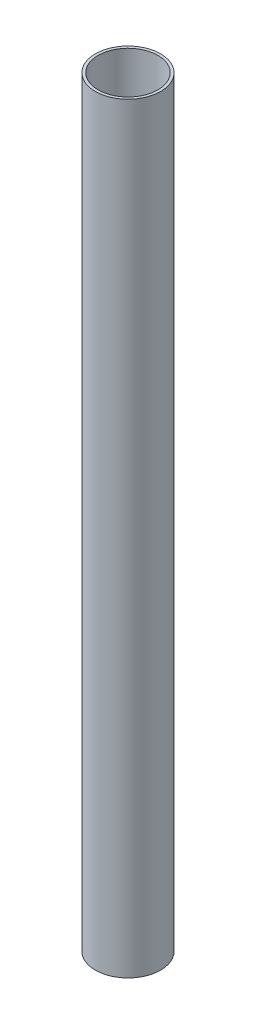
ISO-10303-21;
HEADER;
FILE_DESCRIPTION(('STEP AP214'),'2;1');
FILE_NAME('part.step','',(''),(''),'','','');
FILE_SCHEMA(('AUTOMOTIVE_DESIGN { 1 0 10303 214 1 1 1 1 }'));
ENDSEC;
DATA;
#1=APPLICATION_CONTEXT('core data for automotive mechanical design processes');
#2=APPLICATION_PROTOCOL_DEFINITION('international standard','automotive_design',2000,#1);
#3=PRODUCT_CONTEXT('',#1,'mechanical');
#4=PRODUCT('Part','Part','',(#3));
#5=PRODUCT_RELATED_PRODUCT_CATEGORY('part','',(#4));
#6=PRODUCT_DEFINITION_FORMATION('','',#4);
#7=PRODUCT_DEFINITION_CONTEXT('part definition',#1,'design');
#8=PRODUCT_DEFINITION('design','',#6,#7);
#9=PRODUCT_DEFINITION_SHAPE('','',#8);
#10=(LENGTH_UNIT() NAMED_UNIT(*) SI_UNIT(.MILLI.,.METRE.));
#11=(NAMED_UNIT(*) PLANE_ANGLE_UNIT() SI_UNIT($,.RADIAN.));
#12=(NAMED_UNIT(*) SI_UNIT($,.STERADIAN.) SOLID_ANGLE_UNIT());
#13=UNCERTAINTY_MEASURE_WITH_UNIT(LENGTH_MEASURE(1.E-05),#10,'distance_accuracy_value','');
#14=(GEOMETRIC_REPRESENTATION_CONTEXT(3) GLOBAL_UNCERTAINTY_ASSIGNED_CONTEXT((#13)) GLOBAL_UNIT_ASSIGNED_CONTEXT((#10,
#11,#12)) REPRESENTATION_CONTEXT('',''));
#15=CARTESIAN_POINT('',(0.,0.,0.));
#16=DIRECTION('',(0.,0.,1.));
#17=DIRECTION('',(1.,0.,0.));
#18=AXIS2_PLACEMENT_3D('',#15,#16,#17);
#19=CARTESIAN_POINT('',(0.,140.,0.));
#20=DIRECTION('',(0.,1.,0.));
#21=DIRECTION('',(0.,0.,1.));
#22=AXIS2_PLACEMENT_3D('',#19,#20,#21);
#23=PLANE('',#22);
#24=CARTESIAN_POINT('',(0.,140.,0.));
#25=DIRECTION('',(0.,1.,0.));
#26=DIRECTION('',(0.,0.,1.));
#27=AXIS2_PLACEMENT_3D('',#24,#25,#26);
#28=CIRCLE('',#27,6.);
#29=CARTESIAN_POINT('',(0.,140.,6.));
#30=VERTEX_POINT('',#29);
#31=EDGE_CURVE('E10',#30,#30,#28,.T.);
#32=ORIENTED_EDGE('',*,*,#31,.T.);
#33=EDGE_LOOP('',(#32));
#34=FACE_BOUND('',#33,.T.);
#35=CARTESIAN_POINT('',(0.,140.,0.));
#36=DIRECTION('',(0.,1.,0.));
#37=DIRECTION('',(0.,0.,1.));
#38=AXIS2_PLACEMENT_3D('',#35,#36,#37);
#39=CIRCLE('',#38,5.5);
#40=CARTESIAN_POINT('',(0.,140.,5.5));
#41=VERTEX_POINT('',#40);
#42=EDGE_CURVE('E42',#41,#41,#39,.T.);
#43=ORIENTED_EDGE('',*,*,#42,.F.);
#44=EDGE_LOOP('',(#43));
#45=FACE_BOUND('',#44,.T.);
#46=ADVANCED_FACE('F31',(#34,#45),#23,.T.);
#47=CARTESIAN_POINT('',(0.,0.,0.));
#48=DIRECTION('',(0.,1.,0.));
#49=DIRECTION('',(0.,0.,1.));
#50=AXIS2_PLACEMENT_3D('',#47,#48,#49);
#51=PLANE('',#50);
#52=CARTESIAN_POINT('',(0.,0.,0.));
#53=DIRECTION('',(0.,1.,0.));
#54=DIRECTION('',(0.,0.,1.));
#55=AXIS2_PLACEMENT_3D('',#52,#53,#54);
#56=CIRCLE('',#55,6.);
#57=CARTESIAN_POINT('',(0.,0.,6.));
#58=VERTEX_POINT('',#57);
#59=EDGE_CURVE('E35',#58,#58,#56,.T.);
#60=ORIENTED_EDGE('',*,*,#59,.F.);
#61=EDGE_LOOP('',(#60));
#62=FACE_BOUND('',#61,.T.);
#63=CARTESIAN_POINT('',(0.,0.,0.));
#64=DIRECTION('',(0.,1.,0.));
#65=DIRECTION('',(0.,0.,1.));
#66=AXIS2_PLACEMENT_3D('',#63,#64,#65);
#67=CIRCLE('',#66,5.5);
#68=CARTESIAN_POINT('',(0.,0.,5.5));
#69=VERTEX_POINT('',#68);
#70=EDGE_CURVE('E44',#69,#69,#67,.T.);
#71=ORIENTED_EDGE('',*,*,#70,.T.);
#72=EDGE_LOOP('',(#71));
#73=FACE_BOUND('',#72,.T.);
#74=ADVANCED_FACE('F54',(#62,#73),#51,.F.);
#75=CARTESIAN_POINT('',(0.,140.,0.));
#76=DIRECTION('',(0.,-1.,0.));
#77=DIRECTION('',(0.,0.,-1.));
#78=AXIS2_PLACEMENT_3D('',#75,#76,#77);
#79=CYLINDRICAL_SURFACE('',#78,6.);
#80=ORIENTED_EDGE('',*,*,#31,.F.);
#81=EDGE_LOOP('',(#80));
#82=FACE_BOUND('',#81,.T.);
#83=ORIENTED_EDGE('',*,*,#59,.T.);
#84=EDGE_LOOP('',(#83));
#85=FACE_BOUND('',#84,.T.);
#86=ADVANCED_FACE('F33',(#82,#85),#79,.T.);
#87=CARTESIAN_POINT('',(0.,140.,0.));
#88=DIRECTION('',(0.,-1.,0.));
#89=DIRECTION('',(0.,0.,-1.));
#90=AXIS2_PLACEMENT_3D('',#87,#88,#89);
#91=CYLINDRICAL_SURFACE('',#90,5.5);
#92=ORIENTED_EDGE('',*,*,#42,.T.);
#93=EDGE_LOOP('',(#92));
#94=FACE_BOUND('',#93,.T.);
#95=ORIENTED_EDGE('',*,*,#70,.F.);
#96=EDGE_LOOP('',(#95));
#97=FACE_BOUND('',#96,.T.);
#98=ADVANCED_FACE('F50',(#94,#97),#91,.F.);
#99=CLOSED_SHELL('',(#46,#74,#86,#98));
#100=MANIFOLD_SOLID_BREP('B2',#99);
#101=ADVANCED_BREP_SHAPE_REPRESENTATION('',(#18,#100),#14);
#102=SHAPE_DEFINITION_REPRESENTATION(#9,#101);
ENDSEC;
END-ISO-10303-21;
